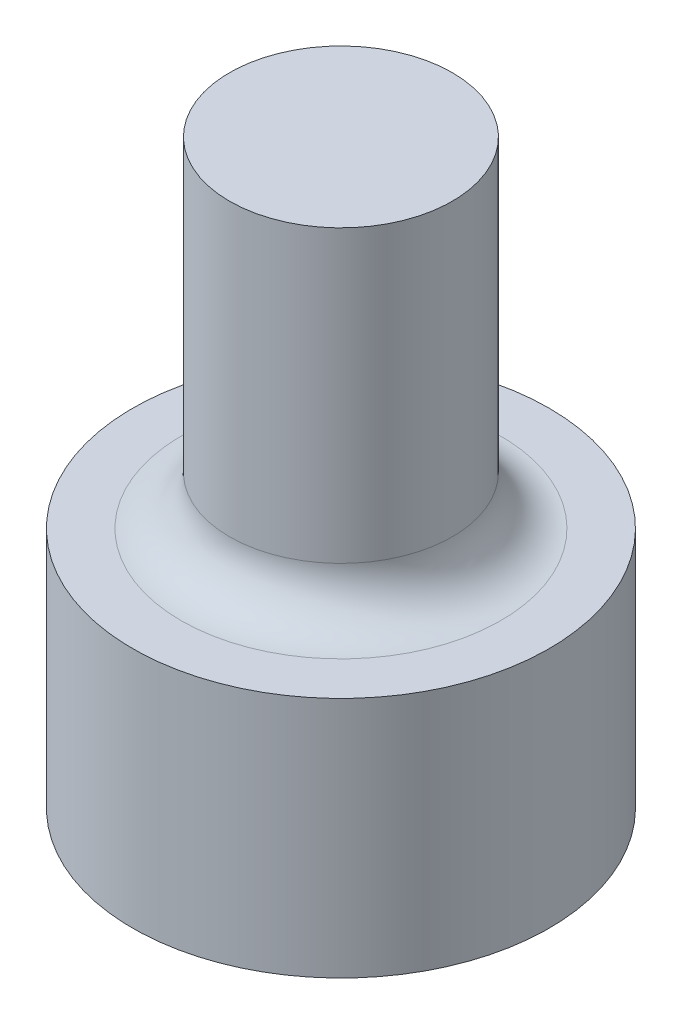
ISO-10303-21;
HEADER;
FILE_DESCRIPTION(('STEP AP214'),'2;1');
FILE_NAME('part.step','',(''),(''),'','','');
FILE_SCHEMA(('AUTOMOTIVE_DESIGN { 1 0 10303 214 1 1 1 1 }'));
ENDSEC;
DATA;
#1=APPLICATION_CONTEXT('core data for automotive mechanical design processes');
#2=APPLICATION_PROTOCOL_DEFINITION('international standard','automotive_design',2000,#1);
#3=PRODUCT_CONTEXT('',#1,'mechanical');
#4=PRODUCT('Part','Part','',(#3));
#5=PRODUCT_RELATED_PRODUCT_CATEGORY('part','',(#4));
#6=PRODUCT_DEFINITION_FORMATION('','',#4);
#7=PRODUCT_DEFINITION_CONTEXT('part definition',#1,'design');
#8=PRODUCT_DEFINITION('design','',#6,#7);
#9=PRODUCT_DEFINITION_SHAPE('','',#8);
#10=(LENGTH_UNIT() NAMED_UNIT(*) SI_UNIT(.MILLI.,.METRE.));
#11=(NAMED_UNIT(*) PLANE_ANGLE_UNIT() SI_UNIT($,.RADIAN.));
#12=(NAMED_UNIT(*) SI_UNIT($,.STERADIAN.) SOLID_ANGLE_UNIT());
#13=UNCERTAINTY_MEASURE_WITH_UNIT(LENGTH_MEASURE(1.E-05),#10,'distance_accuracy_value','');
#14=(GEOMETRIC_REPRESENTATION_CONTEXT(3) GLOBAL_UNCERTAINTY_ASSIGNED_CONTEXT((#13)) GLOBAL_UNIT_ASSIGNED_CONTEXT((#10,
#11,#12)) REPRESENTATION_CONTEXT('',''));
#15=CARTESIAN_POINT('',(0.,0.,0.));
#16=DIRECTION('',(0.,0.,1.));
#17=DIRECTION('',(1.,0.,0.));
#18=AXIS2_PLACEMENT_3D('',#15,#16,#17);
#19=CARTESIAN_POINT('',(0.,15.24,0.));
#20=DIRECTION('',(0.,-1.,0.));
#21=DIRECTION('',(0.,0.,-1.));
#22=AXIS2_PLACEMENT_3D('',#19,#20,#21);
#23=CYLINDRICAL_SURFACE('',#22,5.461);
#24=CARTESIAN_POINT('',(0.,0.,0.));
#25=DIRECTION('',(0.,1.,0.));
#26=DIRECTION('',(0.,0.,1.));
#27=AXIS2_PLACEMENT_3D('',#24,#25,#26);
#28=CIRCLE('',#27,5.461);
#29=CARTESIAN_POINT('',(0.,0.,-5.461));
#30=VERTEX_POINT('',#29);
#31=EDGE_CURVE('E51',#30,#30,#28,.T.);
#32=CARTESIAN_POINT('',(0.,6.35,0.));
#33=DIRECTION('',(0.,1.,0.));
#34=DIRECTION('',(0.,0.,1.));
#35=AXIS2_PLACEMENT_3D('',#32,#33,#34);
#36=CIRCLE('',#35,5.461);
#37=CARTESIAN_POINT('',(0.,6.35,-5.461));
#38=VERTEX_POINT('',#37);
#39=EDGE_CURVE('E56',#38,#38,#36,.T.);
#40=CARTESIAN_POINT('',(0.,0.,-5.461));
#41=CARTESIAN_POINT('',(0.,0.0661458333333336,-5.461));
#42=CARTESIAN_POINT('',(0.,0.132291666666667,-5.461));
#43=CARTESIAN_POINT('',(0.,0.264583333333334,-5.461));
#44=CARTESIAN_POINT('',(0.,0.330729166666667,-5.461));
#45=CARTESIAN_POINT('',(0.,0.463020833333333,-5.461));
#46=CARTESIAN_POINT('',(0.,0.529166666666667,-5.461));
#47=CARTESIAN_POINT('',(0.,0.661458333333333,-5.461));
#48=CARTESIAN_POINT('',(0.,0.727604166666666,-5.461));
#49=CARTESIAN_POINT('',(0.,0.859895833333333,-5.461));
#50=CARTESIAN_POINT('',(0.,0.926041666666666,-5.461));
#51=CARTESIAN_POINT('',(0.,1.05833333333333,-5.461));
#52=CARTESIAN_POINT('',(0.,1.12447916666667,-5.461));
#53=CARTESIAN_POINT('',(0.,1.25677083333333,-5.461));
#54=CARTESIAN_POINT('',(0.,1.32291666666667,-5.461));
#55=CARTESIAN_POINT('',(0.,1.45520833333333,-5.461));
#56=CARTESIAN_POINT('',(0.,1.52135416666667,-5.461));
#57=CARTESIAN_POINT('',(0.,1.65364583333333,-5.461));
#58=CARTESIAN_POINT('',(0.,1.71979166666667,-5.461));
#59=CARTESIAN_POINT('',(0.,1.85208333333333,-5.461));
#60=CARTESIAN_POINT('',(0.,1.91822916666667,-5.461));
#61=CARTESIAN_POINT('',(0.,2.05052083333333,-5.461));
#62=CARTESIAN_POINT('',(0.,2.11666666666667,-5.461));
#63=CARTESIAN_POINT('',(0.,2.24895833333333,-5.461));
#64=CARTESIAN_POINT('',(0.,2.31510416666667,-5.461));
#65=CARTESIAN_POINT('',(0.,2.44739583333333,-5.461));
#66=CARTESIAN_POINT('',(0.,2.51354166666667,-5.461));
#67=CARTESIAN_POINT('',(0.,2.64583333333333,-5.461));
#68=CARTESIAN_POINT('',(0.,2.71197916666667,-5.461));
#69=CARTESIAN_POINT('',(0.,2.84427083333333,-5.461));
#70=CARTESIAN_POINT('',(0.,2.91041666666667,-5.461));
#71=CARTESIAN_POINT('',(0.,3.04270833333333,-5.461));
#72=CARTESIAN_POINT('',(0.,3.10885416666667,-5.461));
#73=CARTESIAN_POINT('',(0.,3.24114583333333,-5.461));
#74=CARTESIAN_POINT('',(0.,3.30729166666667,-5.461));
#75=CARTESIAN_POINT('',(0.,3.43958333333333,-5.461));
#76=CARTESIAN_POINT('',(0.,3.50572916666667,-5.461));
#77=CARTESIAN_POINT('',(0.,3.63802083333333,-5.461));
#78=CARTESIAN_POINT('',(0.,3.70416666666667,-5.461));
#79=CARTESIAN_POINT('',(0.,3.83645833333333,-5.461));
#80=CARTESIAN_POINT('',(0.,3.90260416666667,-5.461));
#81=CARTESIAN_POINT('',(0.,4.03489583333333,-5.461));
#82=CARTESIAN_POINT('',(0.,4.10104166666667,-5.461));
#83=CARTESIAN_POINT('',(0.,4.23333333333333,-5.461));
#84=CARTESIAN_POINT('',(0.,4.29947916666667,-5.461));
#85=CARTESIAN_POINT('',(0.,4.43177083333333,-5.461));
#86=CARTESIAN_POINT('',(0.,4.49791666666667,-5.461));
#87=CARTESIAN_POINT('',(0.,4.63020833333333,-5.461));
#88=CARTESIAN_POINT('',(0.,4.69635416666667,-5.461));
#89=CARTESIAN_POINT('',(0.,4.82864583333333,-5.461));
#90=CARTESIAN_POINT('',(0.,4.89479166666667,-5.461));
#91=CARTESIAN_POINT('',(0.,5.02708333333333,-5.461));
#92=CARTESIAN_POINT('',(0.,5.09322916666666,-5.461));
#93=CARTESIAN_POINT('',(0.,5.22552083333333,-5.461));
#94=CARTESIAN_POINT('',(0.,5.29166666666666,-5.461));
#95=CARTESIAN_POINT('',(0.,5.42395833333333,-5.461));
#96=CARTESIAN_POINT('',(0.,5.49010416666667,-5.461));
#97=CARTESIAN_POINT('',(0.,5.62239583333333,-5.461));
#98=CARTESIAN_POINT('',(0.,5.68854166666666,-5.461));
#99=CARTESIAN_POINT('',(0.,5.82083333333333,-5.461));
#100=CARTESIAN_POINT('',(0.,5.88697916666666,-5.461));
#101=CARTESIAN_POINT('',(0.,6.01927083333333,-5.461));
#102=CARTESIAN_POINT('',(0.,6.08541666666667,-5.461));
#103=CARTESIAN_POINT('',(0.,6.21770833333333,-5.461));
#104=CARTESIAN_POINT('',(0.,6.28385416666667,-5.461));
#105=CARTESIAN_POINT('',(0.,6.35,-5.461));
#106=B_SPLINE_CURVE_WITH_KNOTS('',3,(#40,#41,#42,#43,#44,#45,#46,#47,#48,#49,#50,#51,#52,#53,
#54,#55,#56,#57,#58,#59,#60,#61,#62,#63,#64,#65,#66,#67,#68,#69,#70,#71,#72,#73,#74,#75,#76,#77,
#78,#79,#80,#81,#82,#83,#84,#85,#86,#87,#88,#89,#90,#91,#92,#93,#94,#95,#96,#97,#98,#99,#100,
#101,#102,#103,#104,#105),.UNSPECIFIED.,.F.,.F.,(4,2,2,2,2,2,2,2,2,2,2,2,2,2,2,2,2,2,2,2,2,2,2,
2,2,2,2,2,2,2,2,2,4),(0.,0.198437500000001,0.396875,0.5953125,0.793749999999999,0.9921875,
1.190625,1.3890625,1.5875,1.7859375,1.984375,2.1828125,2.38125,2.5796875,2.778125,2.9765625,
3.175,3.3734375,3.571875,3.7703125,3.96875,4.1671875,4.365625,4.5640625,4.7625,4.9609375,
5.159375,5.3578125,5.55625,5.7546875,5.953125,6.1515625,6.35),.UNSPECIFIED.);
#107=EDGE_CURVE('BSEAM38',#30,#38,#106,.T.);
#108=ORIENTED_EDGE('',*,*,#31,.T.);
#109=ORIENTED_EDGE('',*,*,#39,.F.);
#110=ORIENTED_EDGE('',*,*,#107,.T.);
#111=ORIENTED_EDGE('',*,*,#107,.F.);
#112=EDGE_LOOP('',(#108,#110,#109,#111));
#113=FACE_BOUND('',#112,.T.);
#114=ADVANCED_FACE('F38',(#113),#23,.T.);
#115=CARTESIAN_POINT('',(0.,0.,0.));
#116=DIRECTION('',(0.,1.,0.));
#117=DIRECTION('',(0.,0.,1.));
#118=AXIS2_PLACEMENT_3D('',#115,#116,#117);
#119=PLANE('',#118);
#120=CARTESIAN_POINT('',(0.,0.,0.));
#121=DIRECTION('',(0.,-1.,0.));
#122=DIRECTION('',(0.,0.,-1.));
#123=AXIS2_PLACEMENT_3D('',#120,#121,#122);
#124=CIRCLE('',#123,4.8895);
#125=CARTESIAN_POINT('',(0.,0.,-4.8895));
#126=VERTEX_POINT('',#125);
#127=EDGE_CURVE('E67',#126,#126,#124,.T.);
#128=ORIENTED_EDGE('',*,*,#127,.F.);
#129=EDGE_LOOP('',(#128));
#130=FACE_BOUND('',#129,.T.);
#131=ORIENTED_EDGE('',*,*,#31,.F.);
#132=EDGE_LOOP('',(#131));
#133=FACE_BOUND('',#132,.T.);
#134=ADVANCED_FACE('F84',(#130,#133),#119,.F.);
#135=CARTESIAN_POINT('',(0.,6.35,0.));
#136=DIRECTION('',(0.,1.,0.));
#137=DIRECTION('',(0.,0.,1.));
#138=AXIS2_PLACEMENT_3D('',#135,#136,#137);
#139=PLANE('',#138);
#140=CARTESIAN_POINT('',(0.,6.35,0.));
#141=DIRECTION('',(0.,1.,0.));
#142=DIRECTION('',(0.,0.,1.));
#143=AXIS2_PLACEMENT_3D('',#140,#141,#142);
#144=CIRCLE('',#143,4.191);
#145=CARTESIAN_POINT('',(0.,6.35,4.191));
#146=VERTEX_POINT('',#145);
#147=EDGE_CURVE('E11',#146,#146,#144,.F.);
#148=ORIENTED_EDGE('',*,*,#147,.T.);
#149=EDGE_LOOP('',(#148));
#150=FACE_BOUND('',#149,.T.);
#151=ORIENTED_EDGE('',*,*,#39,.T.);
#152=EDGE_LOOP('',(#151));
#153=FACE_BOUND('',#152,.T.);
#154=ADVANCED_FACE('F87',(#150,#153),#139,.T.);
#155=CARTESIAN_POINT('',(0.,6.35,0.));
#156=DIRECTION('',(0.,1.,0.));
#157=DIRECTION('',(0.,0.,1.));
#158=AXIS2_PLACEMENT_3D('',#155,#156,#157);
#159=CYLINDRICAL_SURFACE('',#158,2.921);
#160=CARTESIAN_POINT('',(0.,7.62,0.));
#161=DIRECTION('',(0.,1.,0.));
#162=DIRECTION('',(0.,0.,1.));
#163=AXIS2_PLACEMENT_3D('',#160,#161,#162);
#164=CIRCLE('',#163,2.921);
#165=CARTESIAN_POINT('',(0.,7.62,2.921));
#166=VERTEX_POINT('',#165);
#167=EDGE_CURVE('E46',#166,#166,#164,.T.);
#168=ORIENTED_EDGE('',*,*,#167,.T.);
#169=EDGE_LOOP('',(#168));
#170=FACE_BOUND('',#169,.T.);
#171=CARTESIAN_POINT('',(0.,15.24,0.));
#172=DIRECTION('',(0.,1.,0.));
#173=DIRECTION('',(0.,0.,1.));
#174=AXIS2_PLACEMENT_3D('',#171,#172,#173);
#175=CIRCLE('',#174,2.921);
#176=CARTESIAN_POINT('',(0.,15.24,2.921));
#177=VERTEX_POINT('',#176);
#178=EDGE_CURVE('E61',#177,#177,#175,.T.);
#179=ORIENTED_EDGE('',*,*,#178,.F.);
#180=EDGE_LOOP('',(#179));
#181=FACE_BOUND('',#180,.T.);
#182=ADVANCED_FACE('F96',(#170,#181),#159,.T.);
#183=CARTESIAN_POINT('',(0.,15.24,0.));
#184=DIRECTION('',(0.,1.,0.));
#185=DIRECTION('',(0.,0.,1.));
#186=AXIS2_PLACEMENT_3D('',#183,#184,#185);
#187=PLANE('',#186);
#188=ORIENTED_EDGE('',*,*,#178,.T.);
#189=EDGE_LOOP('',(#188));
#190=FACE_BOUND('',#189,.T.);
#191=ADVANCED_FACE('F80',(#190),#187,.T.);
#192=CARTESIAN_POINT('',(0.,5.08,0.));
#193=DIRECTION('',(0.,-1.,0.));
#194=DIRECTION('',(0.,0.,-1.));
#195=AXIS2_PLACEMENT_3D('',#192,#193,#194);
#196=CYLINDRICAL_SURFACE('',#195,4.8895);
#197=CARTESIAN_POINT('',(0.,5.08,0.));
#198=DIRECTION('',(0.,-1.,0.));
#199=DIRECTION('',(0.,0.,-1.));
#200=AXIS2_PLACEMENT_3D('',#197,#198,#199);
#201=CIRCLE('',#200,4.8895);
#202=CARTESIAN_POINT('',(0.,5.08,-4.8895));
#203=VERTEX_POINT('',#202);
#204=EDGE_CURVE('E66',#203,#203,#201,.T.);
#205=ORIENTED_EDGE('',*,*,#204,.F.);
#206=EDGE_LOOP('',(#205));
#207=FACE_BOUND('',#206,.T.);
#208=ORIENTED_EDGE('',*,*,#127,.T.);
#209=EDGE_LOOP('',(#208));
#210=FACE_BOUND('',#209,.T.);
#211=ADVANCED_FACE('F77',(#207,#210),#196,.F.);
#212=CARTESIAN_POINT('',(0.,5.08,0.));
#213=DIRECTION('',(0.,-1.,0.));
#214=DIRECTION('',(0.,0.,-1.));
#215=AXIS2_PLACEMENT_3D('',#212,#213,#214);
#216=PLANE('',#215);
#217=ORIENTED_EDGE('',*,*,#204,.T.);
#218=EDGE_LOOP('',(#217));
#219=FACE_BOUND('',#218,.T.);
#220=ADVANCED_FACE('F75',(#219),#216,.T.);
#221=CARTESIAN_POINT('',(0.,7.62,0.));
#222=DIRECTION('',(0.,1.,0.));
#223=DIRECTION('',(0.,0.,1.));
#224=AXIS2_PLACEMENT_3D('',#221,#222,#223);
#225=TOROIDAL_SURFACE('',#224,4.191,1.27);
#226=ORIENTED_EDGE('',*,*,#147,.F.);
#227=EDGE_LOOP('',(#226));
#228=FACE_BOUND('',#227,.T.);
#229=ORIENTED_EDGE('',*,*,#167,.F.);
#230=EDGE_LOOP('',(#229));
#231=FACE_BOUND('',#230,.T.);
#232=ADVANCED_FACE('F40',(#228,#231),#225,.F.);
#233=CLOSED_SHELL('',(#114,#134,#154,#182,#191,#211,#220,#232));
#234=MANIFOLD_SOLID_BREP('B2',#233);
#235=ADVANCED_BREP_SHAPE_REPRESENTATION('',(#18,#234),#14);
#236=SHAPE_DEFINITION_REPRESENTATION(#9,#235);
ENDSEC;
END-ISO-10303-21;
